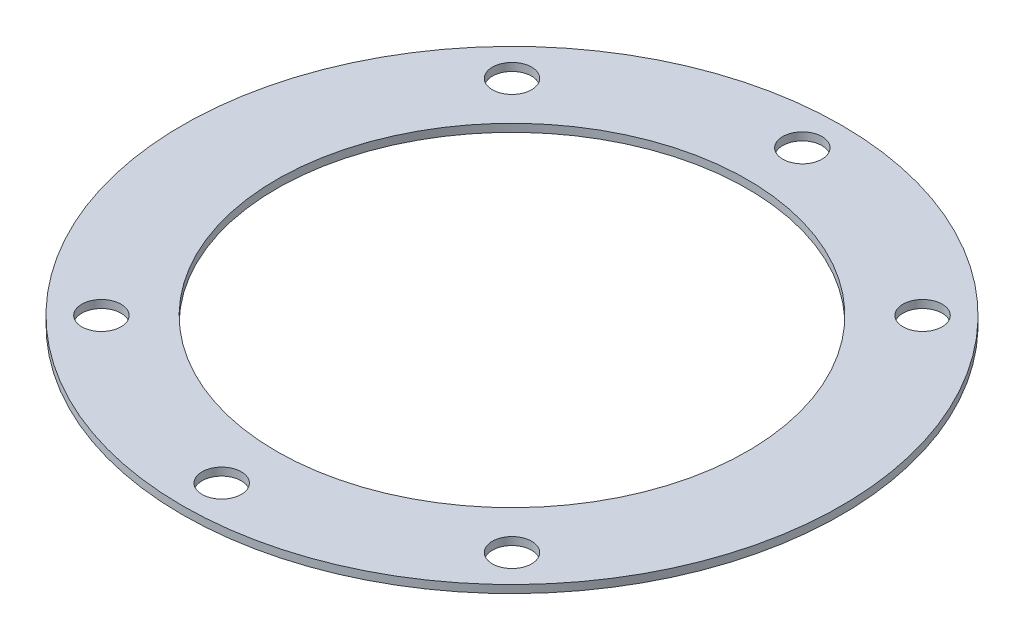
ISO-10303-21;
HEADER;
FILE_DESCRIPTION(('STEP AP214'),'2;1');
FILE_NAME('part.step','',(''),(''),'','','');
FILE_SCHEMA(('AUTOMOTIVE_DESIGN { 1 0 10303 214 1 1 1 1 }'));
ENDSEC;
DATA;
#1=APPLICATION_CONTEXT('core data for automotive mechanical design processes');
#2=APPLICATION_PROTOCOL_DEFINITION('international standard','automotive_design',2000,#1);
#3=PRODUCT_CONTEXT('',#1,'mechanical');
#4=PRODUCT('Part','Part','',(#3));
#5=PRODUCT_RELATED_PRODUCT_CATEGORY('part','',(#4));
#6=PRODUCT_DEFINITION_FORMATION('','',#4);
#7=PRODUCT_DEFINITION_CONTEXT('part definition',#1,'design');
#8=PRODUCT_DEFINITION('design','',#6,#7);
#9=PRODUCT_DEFINITION_SHAPE('','',#8);
#10=(LENGTH_UNIT() NAMED_UNIT(*) SI_UNIT(.MILLI.,.METRE.));
#11=(NAMED_UNIT(*) PLANE_ANGLE_UNIT() SI_UNIT($,.RADIAN.));
#12=(NAMED_UNIT(*) SI_UNIT($,.STERADIAN.) SOLID_ANGLE_UNIT());
#13=UNCERTAINTY_MEASURE_WITH_UNIT(LENGTH_MEASURE(1.E-05),#10,'distance_accuracy_value','');
#14=(GEOMETRIC_REPRESENTATION_CONTEXT(3) GLOBAL_UNCERTAINTY_ASSIGNED_CONTEXT((#13)) GLOBAL_UNIT_ASSIGNED_CONTEXT((#10,
#11,#12)) REPRESENTATION_CONTEXT('',''));
#15=CARTESIAN_POINT('',(0.,0.,0.));
#16=DIRECTION('',(0.,0.,1.));
#17=DIRECTION('',(1.,0.,0.));
#18=AXIS2_PLACEMENT_3D('',#15,#16,#17);
#19=CARTESIAN_POINT('',(0.,0.,0.));
#20=DIRECTION('',(0.,1.,0.));
#21=DIRECTION('',(0.,0.,1.));
#22=AXIS2_PLACEMENT_3D('',#19,#20,#21);
#23=CYLINDRICAL_SURFACE('',#22,42.);
#24=CARTESIAN_POINT('',(0.,0.,0.));
#25=DIRECTION('',(0.,1.,0.));
#26=DIRECTION('',(0.,0.,1.));
#27=AXIS2_PLACEMENT_3D('',#24,#25,#26);
#28=CIRCLE('',#27,42.);
#29=CARTESIAN_POINT('',(0.,0.,42.));
#30=VERTEX_POINT('',#29);
#31=EDGE_CURVE('E47',#30,#30,#28,.T.);
#32=ORIENTED_EDGE('',*,*,#31,.T.);
#33=EDGE_LOOP('',(#32));
#34=FACE_BOUND('',#33,.T.);
#35=CARTESIAN_POINT('',(0.,1.,0.));
#36=DIRECTION('',(0.,1.,0.));
#37=DIRECTION('',(0.,0.,1.));
#38=AXIS2_PLACEMENT_3D('',#35,#36,#37);
#39=CIRCLE('',#38,42.);
#40=CARTESIAN_POINT('',(0.,0.999999999999998,42.));
#41=VERTEX_POINT('',#40);
#42=EDGE_CURVE('E10',#41,#41,#39,.T.);
#43=ORIENTED_EDGE('',*,*,#42,.F.);
#44=EDGE_LOOP('',(#43));
#45=FACE_BOUND('',#44,.T.);
#46=ADVANCED_FACE('F33',(#34,#45),#23,.T.);
#47=CARTESIAN_POINT('',(0.,1.,30.));
#48=DIRECTION('',(0.,1.,0.));
#49=DIRECTION('',(0.,0.,1.));
#50=AXIS2_PLACEMENT_3D('',#47,#48,#49);
#51=PLANE('',#50);
#52=CARTESIAN_POINT('',(-26.1629509039025,1.00000000000001,26.162950903902));
#53=DIRECTION('',(0.,1.,0.));
#54=DIRECTION('',(0.,0.,1.));
#55=AXIS2_PLACEMENT_3D('',#52,#53,#54);
#56=CIRCLE('',#55,2.49999999999999);
#57=CARTESIAN_POINT('',(-26.1629509039025,1.00000000000001,28.662950903902));
#58=VERTEX_POINT('',#57);
#59=EDGE_CURVE('E85',#58,#58,#56,.T.);
#60=ORIENTED_EDGE('',*,*,#59,.F.);
#61=EDGE_LOOP('',(#60));
#62=FACE_BOUND('',#61,.T.);
#63=CARTESIAN_POINT('',(26.1629509039023,1.00000000000001,26.1629509039022));
#64=DIRECTION('',(0.,1.,0.));
#65=DIRECTION('',(0.,0.,1.));
#66=AXIS2_PLACEMENT_3D('',#63,#64,#65);
#67=CIRCLE('',#66,2.49999999999999);
#68=CARTESIAN_POINT('',(26.1629509039023,1.00000000000001,28.6629509039022));
#69=VERTEX_POINT('',#68);
#70=EDGE_CURVE('E79',#69,#69,#67,.T.);
#71=ORIENTED_EDGE('',*,*,#70,.F.);
#72=EDGE_LOOP('',(#71));
#73=FACE_BOUND('',#72,.T.);
#74=CARTESIAN_POINT('',(26.1629509039023,1.00000000000001,-26.1629509039022));
#75=DIRECTION('',(0.,1.,0.));
#76=DIRECTION('',(0.,0.,1.));
#77=AXIS2_PLACEMENT_3D('',#74,#75,#76);
#78=CIRCLE('',#77,2.49999999999999);
#79=CARTESIAN_POINT('',(26.1629509039023,1.00000000000001,-23.6629509039022));
#80=VERTEX_POINT('',#79);
#81=EDGE_CURVE('E73',#80,#80,#78,.T.);
#82=ORIENTED_EDGE('',*,*,#81,.F.);
#83=EDGE_LOOP('',(#82));
#84=FACE_BOUND('',#83,.T.);
#85=CARTESIAN_POINT('',(-26.1629509039023,1.00000000000001,-26.1629509039022));
#86=DIRECTION('',(0.,1.,0.));
#87=DIRECTION('',(0.,0.,1.));
#88=AXIS2_PLACEMENT_3D('',#85,#86,#87);
#89=CIRCLE('',#88,2.49999999999999);
#90=CARTESIAN_POINT('',(-26.1629509039023,1.00000000000001,-23.6629509039022));
#91=VERTEX_POINT('',#90);
#92=EDGE_CURVE('E67',#91,#91,#89,.T.);
#93=ORIENTED_EDGE('',*,*,#92,.F.);
#94=EDGE_LOOP('',(#93));
#95=FACE_BOUND('',#94,.T.);
#96=CARTESIAN_POINT('',(0.,1.00000000000001,-37.));
#97=DIRECTION('',(0.,1.,0.));
#98=DIRECTION('',(0.,0.,1.));
#99=AXIS2_PLACEMENT_3D('',#96,#97,#98);
#100=CIRCLE('',#99,2.49999999999999);
#101=CARTESIAN_POINT('',(0.,1.00000000000001,-34.5));
#102=VERTEX_POINT('',#101);
#103=EDGE_CURVE('E61',#102,#102,#100,.T.);
#104=ORIENTED_EDGE('',*,*,#103,.F.);
#105=EDGE_LOOP('',(#104));
#106=FACE_BOUND('',#105,.T.);
#107=CARTESIAN_POINT('',(0.,1.,37.));
#108=DIRECTION('',(0.,1.,0.));
#109=DIRECTION('',(0.,0.,1.));
#110=AXIS2_PLACEMENT_3D('',#107,#108,#109);
#111=CIRCLE('',#110,2.49999999999999);
#112=CARTESIAN_POINT('',(0.,1.,39.5));
#113=VERTEX_POINT('',#112);
#114=EDGE_CURVE('E55',#113,#113,#111,.T.);
#115=ORIENTED_EDGE('',*,*,#114,.F.);
#116=EDGE_LOOP('',(#115));
#117=FACE_BOUND('',#116,.T.);
#118=ORIENTED_EDGE('',*,*,#42,.T.);
#119=EDGE_LOOP('',(#118));
#120=FACE_BOUND('',#119,.T.);
#121=CARTESIAN_POINT('',(0.,1.,0.));
#122=DIRECTION('',(0.,1.,0.));
#123=DIRECTION('',(0.,0.,1.));
#124=AXIS2_PLACEMENT_3D('',#121,#122,#123);
#125=CIRCLE('',#124,30.);
#126=CARTESIAN_POINT('',(0.,1.,30.));
#127=VERTEX_POINT('',#126);
#128=EDGE_CURVE('E39',#127,#127,#125,.T.);
#129=ORIENTED_EDGE('',*,*,#128,.F.);
#130=EDGE_LOOP('',(#129));
#131=FACE_BOUND('',#130,.T.);
#132=ADVANCED_FACE('F91',(#62,#73,#84,#95,#106,#117,#120,#131),#51,.T.);
#133=CARTESIAN_POINT('',(0.,0.,0.));
#134=DIRECTION('',(0.,1.,0.));
#135=DIRECTION('',(0.,0.,1.));
#136=AXIS2_PLACEMENT_3D('',#133,#134,#135);
#137=CYLINDRICAL_SURFACE('',#136,30.);
#138=ORIENTED_EDGE('',*,*,#128,.T.);
#139=EDGE_LOOP('',(#138));
#140=FACE_BOUND('',#139,.T.);
#141=CARTESIAN_POINT('',(0.,0.,0.));
#142=DIRECTION('',(0.,1.,0.));
#143=DIRECTION('',(0.,0.,1.));
#144=AXIS2_PLACEMENT_3D('',#141,#142,#143);
#145=CIRCLE('',#144,30.);
#146=CARTESIAN_POINT('',(0.,0.,30.));
#147=VERTEX_POINT('',#146);
#148=EDGE_CURVE('E43',#147,#147,#145,.T.);
#149=ORIENTED_EDGE('',*,*,#148,.F.);
#150=EDGE_LOOP('',(#149));
#151=FACE_BOUND('',#150,.T.);
#152=ADVANCED_FACE('F94',(#140,#151),#137,.F.);
#153=CARTESIAN_POINT('',(0.,0.,30.));
#154=DIRECTION('',(0.,-1.,0.));
#155=DIRECTION('',(0.,0.,-1.));
#156=AXIS2_PLACEMENT_3D('',#153,#154,#155);
#157=PLANE('',#156);
#158=CARTESIAN_POINT('',(-26.1629509039025,0.,26.162950903902));
#159=DIRECTION('',(0.,1.,0.));
#160=DIRECTION('',(0.,0.,1.));
#161=AXIS2_PLACEMENT_3D('',#158,#159,#160);
#162=CIRCLE('',#161,2.5);
#163=CARTESIAN_POINT('',(-26.1629509039025,0.,28.662950903902));
#164=VERTEX_POINT('',#163);
#165=EDGE_CURVE('E82',#164,#164,#162,.T.);
#166=ORIENTED_EDGE('',*,*,#165,.T.);
#167=EDGE_LOOP('',(#166));
#168=FACE_BOUND('',#167,.T.);
#169=CARTESIAN_POINT('',(26.1629509039023,0.,26.1629509039022));
#170=DIRECTION('',(0.,1.,0.));
#171=DIRECTION('',(0.,0.,1.));
#172=AXIS2_PLACEMENT_3D('',#169,#170,#171);
#173=CIRCLE('',#172,2.5);
#174=CARTESIAN_POINT('',(26.1629509039023,0.,28.6629509039022));
#175=VERTEX_POINT('',#174);
#176=EDGE_CURVE('E76',#175,#175,#173,.T.);
#177=ORIENTED_EDGE('',*,*,#176,.T.);
#178=EDGE_LOOP('',(#177));
#179=FACE_BOUND('',#178,.T.);
#180=CARTESIAN_POINT('',(26.1629509039023,0.,-26.1629509039022));
#181=DIRECTION('',(0.,1.,0.));
#182=DIRECTION('',(0.,0.,1.));
#183=AXIS2_PLACEMENT_3D('',#180,#181,#182);
#184=CIRCLE('',#183,2.5);
#185=CARTESIAN_POINT('',(26.1629509039023,0.,-23.6629509039022));
#186=VERTEX_POINT('',#185);
#187=EDGE_CURVE('E70',#186,#186,#184,.T.);
#188=ORIENTED_EDGE('',*,*,#187,.T.);
#189=EDGE_LOOP('',(#188));
#190=FACE_BOUND('',#189,.T.);
#191=CARTESIAN_POINT('',(-26.1629509039023,0.,-26.1629509039022));
#192=DIRECTION('',(0.,1.,0.));
#193=DIRECTION('',(0.,0.,1.));
#194=AXIS2_PLACEMENT_3D('',#191,#192,#193);
#195=CIRCLE('',#194,2.5);
#196=CARTESIAN_POINT('',(-26.1629509039023,0.,-23.6629509039022));
#197=VERTEX_POINT('',#196);
#198=EDGE_CURVE('E64',#197,#197,#195,.T.);
#199=ORIENTED_EDGE('',*,*,#198,.T.);
#200=EDGE_LOOP('',(#199));
#201=FACE_BOUND('',#200,.T.);
#202=CARTESIAN_POINT('',(0.,0.,-37.));
#203=DIRECTION('',(0.,1.,0.));
#204=DIRECTION('',(0.,0.,1.));
#205=AXIS2_PLACEMENT_3D('',#202,#203,#204);
#206=CIRCLE('',#205,2.5);
#207=CARTESIAN_POINT('',(0.,0.,-34.5));
#208=VERTEX_POINT('',#207);
#209=EDGE_CURVE('E58',#208,#208,#206,.T.);
#210=ORIENTED_EDGE('',*,*,#209,.T.);
#211=EDGE_LOOP('',(#210));
#212=FACE_BOUND('',#211,.T.);
#213=CARTESIAN_POINT('',(0.,0.,37.));
#214=DIRECTION('',(0.,1.,0.));
#215=DIRECTION('',(0.,0.,1.));
#216=AXIS2_PLACEMENT_3D('',#213,#214,#215);
#217=CIRCLE('',#216,2.5);
#218=CARTESIAN_POINT('',(0.,0.,39.5));
#219=VERTEX_POINT('',#218);
#220=EDGE_CURVE('E52',#219,#219,#217,.T.);
#221=ORIENTED_EDGE('',*,*,#220,.T.);
#222=EDGE_LOOP('',(#221));
#223=FACE_BOUND('',#222,.T.);
#224=ORIENTED_EDGE('',*,*,#148,.T.);
#225=EDGE_LOOP('',(#224));
#226=FACE_BOUND('',#225,.T.);
#227=ORIENTED_EDGE('',*,*,#31,.F.);
#228=EDGE_LOOP('',(#227));
#229=FACE_BOUND('',#228,.T.);
#230=ADVANCED_FACE('F109',(#168,#179,#190,#201,#212,#223,#226,#229),#157,.T.);
#231=CARTESIAN_POINT('',(0.,0.999999999999999,37.));
#232=DIRECTION('',(0.,1.,0.));
#233=DIRECTION('',(0.,0.,1.));
#234=AXIS2_PLACEMENT_3D('',#231,#232,#233);
#235=CYLINDRICAL_SURFACE('',#234,2.49999999999999);
#236=ORIENTED_EDGE('',*,*,#220,.F.);
#237=EDGE_LOOP('',(#236));
#238=FACE_BOUND('',#237,.T.);
#239=ORIENTED_EDGE('',*,*,#114,.T.);
#240=EDGE_LOOP('',(#239));
#241=FACE_BOUND('',#240,.T.);
#242=ADVANCED_FACE('F106',(#238,#241),#235,.F.);
#243=CARTESIAN_POINT('',(0.,1.00000000000001,-37.));
#244=DIRECTION('',(0.,1.,0.));
#245=DIRECTION('',(0.,0.,1.));
#246=AXIS2_PLACEMENT_3D('',#243,#244,#245);
#247=CYLINDRICAL_SURFACE('',#246,2.49999999999999);
#248=ORIENTED_EDGE('',*,*,#209,.F.);
#249=EDGE_LOOP('',(#248));
#250=FACE_BOUND('',#249,.T.);
#251=ORIENTED_EDGE('',*,*,#103,.T.);
#252=EDGE_LOOP('',(#251));
#253=FACE_BOUND('',#252,.T.);
#254=ADVANCED_FACE('F108',(#250,#253),#247,.F.);
#255=CARTESIAN_POINT('',(-26.1629509039023,1.00000000000001,-26.1629509039022));
#256=DIRECTION('',(0.,1.,0.));
#257=DIRECTION('',(0.,0.,1.));
#258=AXIS2_PLACEMENT_3D('',#255,#256,#257);
#259=CYLINDRICAL_SURFACE('',#258,2.49999999999999);
#260=ORIENTED_EDGE('',*,*,#198,.F.);
#261=EDGE_LOOP('',(#260));
#262=FACE_BOUND('',#261,.T.);
#263=ORIENTED_EDGE('',*,*,#92,.T.);
#264=EDGE_LOOP('',(#263));
#265=FACE_BOUND('',#264,.T.);
#266=ADVANCED_FACE('F116',(#262,#265),#259,.F.);
#267=CARTESIAN_POINT('',(26.1629509039023,1.00000000000001,-26.1629509039022));
#268=DIRECTION('',(0.,1.,0.));
#269=DIRECTION('',(0.,0.,1.));
#270=AXIS2_PLACEMENT_3D('',#267,#268,#269);
#271=CYLINDRICAL_SURFACE('',#270,2.49999999999999);
#272=ORIENTED_EDGE('',*,*,#187,.F.);
#273=EDGE_LOOP('',(#272));
#274=FACE_BOUND('',#273,.T.);
#275=ORIENTED_EDGE('',*,*,#81,.T.);
#276=EDGE_LOOP('',(#275));
#277=FACE_BOUND('',#276,.T.);
#278=ADVANCED_FACE('F150',(#274,#277),#271,.F.);
#279=CARTESIAN_POINT('',(26.1629509039023,1.00000000000001,26.1629509039022));
#280=DIRECTION('',(0.,1.,0.));
#281=DIRECTION('',(0.,0.,1.));
#282=AXIS2_PLACEMENT_3D('',#279,#280,#281);
#283=CYLINDRICAL_SURFACE('',#282,2.49999999999999);
#284=ORIENTED_EDGE('',*,*,#176,.F.);
#285=EDGE_LOOP('',(#284));
#286=FACE_BOUND('',#285,.T.);
#287=ORIENTED_EDGE('',*,*,#70,.T.);
#288=EDGE_LOOP('',(#287));
#289=FACE_BOUND('',#288,.T.);
#290=ADVANCED_FACE('F156',(#286,#289),#283,.F.);
#291=CARTESIAN_POINT('',(-26.1629509039025,1.00000000000001,26.162950903902));
#292=DIRECTION('',(0.,1.,0.));
#293=DIRECTION('',(0.,0.,1.));
#294=AXIS2_PLACEMENT_3D('',#291,#292,#293);
#295=CYLINDRICAL_SURFACE('',#294,2.49999999999999);
#296=ORIENTED_EDGE('',*,*,#165,.F.);
#297=EDGE_LOOP('',(#296));
#298=FACE_BOUND('',#297,.T.);
#299=ORIENTED_EDGE('',*,*,#59,.T.);
#300=EDGE_LOOP('',(#299));
#301=FACE_BOUND('',#300,.T.);
#302=ADVANCED_FACE('F89',(#298,#301),#295,.F.);
#303=CLOSED_SHELL('',(#46,#132,#152,#230,#242,#254,#266,#278,#290,#302));
#304=MANIFOLD_SOLID_BREP('B2',#303);
#305=ADVANCED_BREP_SHAPE_REPRESENTATION('',(#18,#304),#14);
#306=SHAPE_DEFINITION_REPRESENTATION(#9,#305);
ENDSEC;
END-ISO-10303-21;
